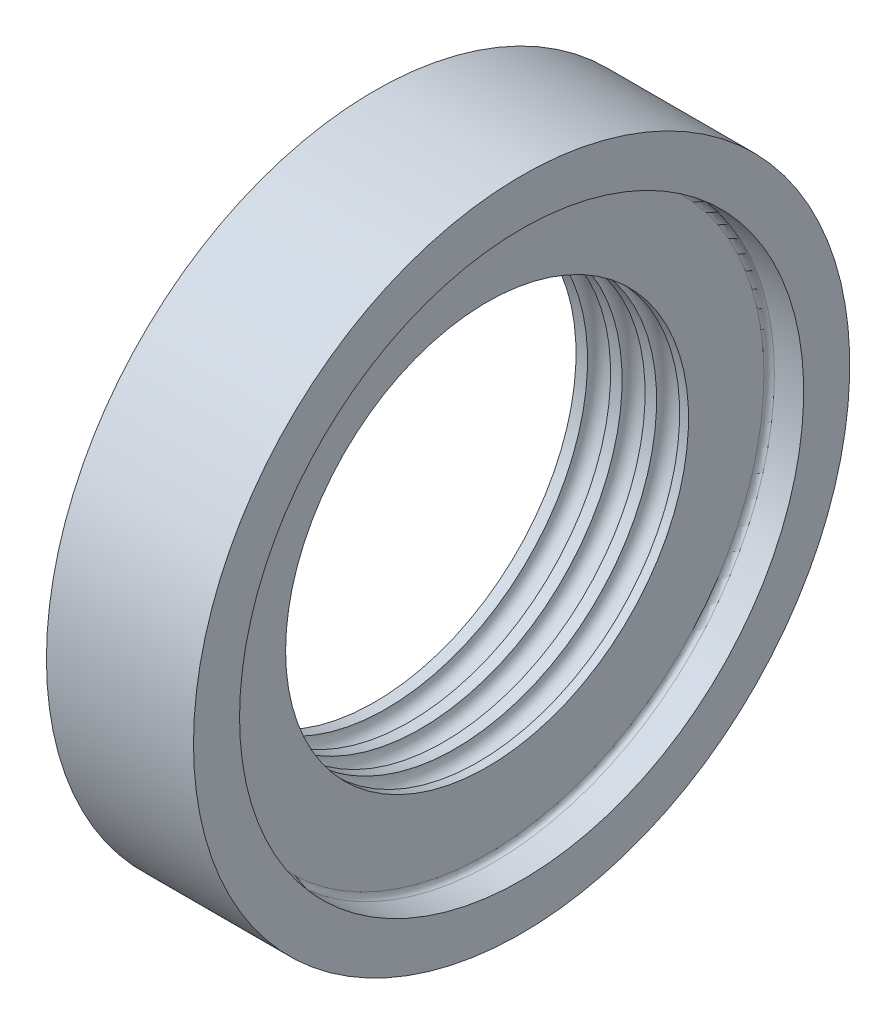
ISO-10303-21;
HEADER;
FILE_DESCRIPTION(('STEP AP214'),'2;1');
FILE_NAME('part.step','',(''),(''),'','','');
FILE_SCHEMA(('AUTOMOTIVE_DESIGN { 1 0 10303 214 1 1 1 1 }'));
ENDSEC;
DATA;
#1=APPLICATION_CONTEXT('core data for automotive mechanical design processes');
#2=APPLICATION_PROTOCOL_DEFINITION('international standard','automotive_design',2000,#1);
#3=PRODUCT_CONTEXT('',#1,'mechanical');
#4=PRODUCT('Part','Part','',(#3));
#5=PRODUCT_RELATED_PRODUCT_CATEGORY('part','',(#4));
#6=PRODUCT_DEFINITION_FORMATION('','',#4);
#7=PRODUCT_DEFINITION_CONTEXT('part definition',#1,'design');
#8=PRODUCT_DEFINITION('design','',#6,#7);
#9=PRODUCT_DEFINITION_SHAPE('','',#8);
#10=(LENGTH_UNIT() NAMED_UNIT(*) SI_UNIT(.MILLI.,.METRE.));
#11=(NAMED_UNIT(*) PLANE_ANGLE_UNIT() SI_UNIT($,.RADIAN.));
#12=(NAMED_UNIT(*) SI_UNIT($,.STERADIAN.) SOLID_ANGLE_UNIT());
#13=UNCERTAINTY_MEASURE_WITH_UNIT(LENGTH_MEASURE(1.E-05),#10,'distance_accuracy_value','');
#14=(GEOMETRIC_REPRESENTATION_CONTEXT(3) GLOBAL_UNCERTAINTY_ASSIGNED_CONTEXT((#13)) GLOBAL_UNIT_ASSIGNED_CONTEXT((#10,
#11,#12)) REPRESENTATION_CONTEXT('',''));
#15=CARTESIAN_POINT('',(0.,0.,0.));
#16=DIRECTION('',(0.,0.,1.));
#17=DIRECTION('',(1.,0.,0.));
#18=AXIS2_PLACEMENT_3D('',#15,#16,#17);
#19=CARTESIAN_POINT('',(8.8,0.,31.35));
#20=DIRECTION('',(-1.,0.,0.));
#21=DIRECTION('',(0.,0.,1.));
#22=AXIS2_PLACEMENT_3D('',#19,#20,#21);
#23=PLANE('',#22);
#24=CARTESIAN_POINT('',(8.8,0.,-25.3));
#25=DIRECTION('',(-1.,0.,0.));
#26=DIRECTION('',(0.,0.,1.));
#27=AXIS2_PLACEMENT_3D('',#24,#25,#26);
#28=CIRCLE('',#27,1.64999999999999);
#29=CARTESIAN_POINT('',(8.8,0.,-23.65));
#30=VERTEX_POINT('',#29);
#31=EDGE_CURVE('E61',#30,#30,#28,.T.);
#32=ORIENTED_EDGE('',*,*,#31,.F.);
#33=EDGE_LOOP('',(#32));
#34=FACE_BOUND('',#33,.T.);
#35=CARTESIAN_POINT('',(8.8,0.,25.3));
#36=DIRECTION('',(-1.,0.,0.));
#37=DIRECTION('',(0.,0.,1.));
#38=AXIS2_PLACEMENT_3D('',#35,#36,#37);
#39=CIRCLE('',#38,1.64999999999999);
#40=CARTESIAN_POINT('',(8.8,0.,26.95));
#41=VERTEX_POINT('',#40);
#42=EDGE_CURVE('E60',#41,#41,#39,.T.);
#43=ORIENTED_EDGE('',*,*,#42,.F.);
#44=EDGE_LOOP('',(#43));
#45=FACE_BOUND('',#44,.T.);
#46=CARTESIAN_POINT('',(8.8,0.,0.));
#47=DIRECTION('',(-1.,0.,0.));
#48=DIRECTION('',(0.,0.,1.));
#49=AXIS2_PLACEMENT_3D('',#46,#47,#48);
#50=CIRCLE('',#49,31.35);
#51=CARTESIAN_POINT('',(8.8,0.,31.35));
#52=VERTEX_POINT('',#51);
#53=EDGE_CURVE('E71',#52,#52,#50,.T.);
#54=ORIENTED_EDGE('',*,*,#53,.T.);
#55=EDGE_LOOP('',(#54));
#56=FACE_BOUND('',#55,.T.);
#57=CARTESIAN_POINT('',(8.8,0.,0.));
#58=DIRECTION('',(-1.,0.,0.));
#59=DIRECTION('',(0.,0.,1.));
#60=AXIS2_PLACEMENT_3D('',#57,#58,#59);
#61=CIRCLE('',#60,19.25);
#62=CARTESIAN_POINT('',(8.8,0.,19.25));
#63=VERTEX_POINT('',#62);
#64=EDGE_CURVE('E101',#63,#63,#61,.T.);
#65=ORIENTED_EDGE('',*,*,#64,.F.);
#66=EDGE_LOOP('',(#65));
#67=FACE_BOUND('',#66,.T.);
#68=ADVANCED_FACE('F36',(#34,#45,#56,#67),#23,.T.);
#69=CARTESIAN_POINT('',(4.10140217499936,0.,0.));
#70=DIRECTION('',(-1.,0.,0.));
#71=DIRECTION('',(0.,0.,1.));
#72=AXIS2_PLACEMENT_3D('',#69,#70,#71);
#73=CYLINDRICAL_SURFACE('',#72,19.25);
#74=ORIENTED_EDGE('',*,*,#64,.T.);
#75=EDGE_LOOP('',(#74));
#76=FACE_BOUND('',#75,.T.);
#77=CARTESIAN_POINT('',(9.9,0.,0.));
#78=DIRECTION('',(-1.,0.,0.));
#79=DIRECTION('',(0.,0.,1.));
#80=AXIS2_PLACEMENT_3D('',#77,#78,#79);
#81=CIRCLE('',#80,19.25);
#82=CARTESIAN_POINT('',(9.9,0.,19.25));
#83=VERTEX_POINT('',#82);
#84=EDGE_CURVE('E98',#83,#83,#81,.T.);
#85=ORIENTED_EDGE('',*,*,#84,.F.);
#86=EDGE_LOOP('',(#85));
#87=FACE_BOUND('',#86,.T.);
#88=ADVANCED_FACE('F117',(#76,#87),#73,.F.);
#89=CARTESIAN_POINT('',(11.,0.,0.));
#90=DIRECTION('',(-1.,0.,0.));
#91=DIRECTION('',(0.,0.,1.));
#92=AXIS2_PLACEMENT_3D('',#89,#90,#91);
#93=TOROIDAL_SURFACE('',#92,19.25,1.1);
#94=ORIENTED_EDGE('',*,*,#84,.T.);
#95=EDGE_LOOP('',(#94));
#96=FACE_BOUND('',#95,.T.);
#97=CARTESIAN_POINT('',(12.1,0.,0.));
#98=DIRECTION('',(-1.,0.,0.));
#99=DIRECTION('',(0.,0.,1.));
#100=AXIS2_PLACEMENT_3D('',#97,#98,#99);
#101=CIRCLE('',#100,19.25);
#102=CARTESIAN_POINT('',(12.1,0.,19.25));
#103=VERTEX_POINT('',#102);
#104=EDGE_CURVE('E95',#103,#103,#101,.T.);
#105=ORIENTED_EDGE('',*,*,#104,.F.);
#106=EDGE_LOOP('',(#105));
#107=FACE_BOUND('',#106,.T.);
#108=ADVANCED_FACE('F122',(#96,#107),#93,.F.);
#109=CARTESIAN_POINT('',(4.10140217499936,0.,0.));
#110=DIRECTION('',(-1.,0.,0.));
#111=DIRECTION('',(0.,0.,1.));
#112=AXIS2_PLACEMENT_3D('',#109,#110,#111);
#113=CYLINDRICAL_SURFACE('',#112,19.25);
#114=ORIENTED_EDGE('',*,*,#104,.T.);
#115=EDGE_LOOP('',(#114));
#116=FACE_BOUND('',#115,.T.);
#117=CARTESIAN_POINT('',(13.2,0.,0.));
#118=DIRECTION('',(-1.,0.,0.));
#119=DIRECTION('',(0.,0.,1.));
#120=AXIS2_PLACEMENT_3D('',#117,#118,#119);
#121=CIRCLE('',#120,19.25);
#122=CARTESIAN_POINT('',(13.2,0.,19.25));
#123=VERTEX_POINT('',#122);
#124=EDGE_CURVE('E92',#123,#123,#121,.T.);
#125=ORIENTED_EDGE('',*,*,#124,.F.);
#126=EDGE_LOOP('',(#125));
#127=FACE_BOUND('',#126,.T.);
#128=ADVANCED_FACE('F130',(#116,#127),#113,.F.);
#129=CARTESIAN_POINT('',(14.3,0.,0.));
#130=DIRECTION('',(-1.,0.,0.));
#131=DIRECTION('',(0.,0.,1.));
#132=AXIS2_PLACEMENT_3D('',#129,#130,#131);
#133=TOROIDAL_SURFACE('',#132,19.25,1.1);
#134=ORIENTED_EDGE('',*,*,#124,.T.);
#135=EDGE_LOOP('',(#134));
#136=FACE_BOUND('',#135,.T.);
#137=CARTESIAN_POINT('',(15.4,0.,0.));
#138=DIRECTION('',(-1.,0.,0.));
#139=DIRECTION('',(0.,0.,1.));
#140=AXIS2_PLACEMENT_3D('',#137,#138,#139);
#141=CIRCLE('',#140,19.25);
#142=CARTESIAN_POINT('',(15.4,0.,19.25));
#143=VERTEX_POINT('',#142);
#144=EDGE_CURVE('E89',#143,#143,#141,.T.);
#145=ORIENTED_EDGE('',*,*,#144,.F.);
#146=EDGE_LOOP('',(#145));
#147=FACE_BOUND('',#146,.T.);
#148=ADVANCED_FACE('F134',(#136,#147),#133,.F.);
#149=CARTESIAN_POINT('',(4.10140217499936,0.,0.));
#150=DIRECTION('',(-1.,0.,0.));
#151=DIRECTION('',(0.,0.,1.));
#152=AXIS2_PLACEMENT_3D('',#149,#150,#151);
#153=CYLINDRICAL_SURFACE('',#152,19.25);
#154=ORIENTED_EDGE('',*,*,#144,.T.);
#155=EDGE_LOOP('',(#154));
#156=FACE_BOUND('',#155,.T.);
#157=CARTESIAN_POINT('',(16.5,0.,0.));
#158=DIRECTION('',(-1.,0.,0.));
#159=DIRECTION('',(0.,0.,1.));
#160=AXIS2_PLACEMENT_3D('',#157,#158,#159);
#161=CIRCLE('',#160,19.25);
#162=CARTESIAN_POINT('',(16.5,0.,19.25));
#163=VERTEX_POINT('',#162);
#164=EDGE_CURVE('E86',#163,#163,#161,.T.);
#165=ORIENTED_EDGE('',*,*,#164,.F.);
#166=EDGE_LOOP('',(#165));
#167=FACE_BOUND('',#166,.T.);
#168=ADVANCED_FACE('F138',(#156,#167),#153,.F.);
#169=CARTESIAN_POINT('',(17.6,0.,0.));
#170=DIRECTION('',(-1.,0.,0.));
#171=DIRECTION('',(0.,0.,1.));
#172=AXIS2_PLACEMENT_3D('',#169,#170,#171);
#173=TOROIDAL_SURFACE('',#172,19.25,1.1);
#174=ORIENTED_EDGE('',*,*,#164,.T.);
#175=EDGE_LOOP('',(#174));
#176=FACE_BOUND('',#175,.T.);
#177=CARTESIAN_POINT('',(18.7,0.,0.));
#178=DIRECTION('',(-1.,0.,0.));
#179=DIRECTION('',(0.,0.,1.));
#180=AXIS2_PLACEMENT_3D('',#177,#178,#179);
#181=CIRCLE('',#180,19.25);
#182=CARTESIAN_POINT('',(18.7,0.,19.25));
#183=VERTEX_POINT('',#182);
#184=EDGE_CURVE('E83',#183,#183,#181,.T.);
#185=ORIENTED_EDGE('',*,*,#184,.F.);
#186=EDGE_LOOP('',(#185));
#187=FACE_BOUND('',#186,.T.);
#188=ADVANCED_FACE('F142',(#176,#187),#173,.F.);
#189=CARTESIAN_POINT('',(4.10140217499936,0.,0.));
#190=DIRECTION('',(-1.,0.,0.));
#191=DIRECTION('',(0.,0.,1.));
#192=AXIS2_PLACEMENT_3D('',#189,#190,#191);
#193=CYLINDRICAL_SURFACE('',#192,19.25);
#194=ORIENTED_EDGE('',*,*,#184,.T.);
#195=EDGE_LOOP('',(#194));
#196=FACE_BOUND('',#195,.T.);
#197=CARTESIAN_POINT('',(19.55,0.,0.));
#198=DIRECTION('',(-1.,0.,0.));
#199=DIRECTION('',(0.,0.,1.));
#200=AXIS2_PLACEMENT_3D('',#197,#198,#199);
#201=CIRCLE('',#200,19.25);
#202=CARTESIAN_POINT('',(19.55,0.,19.25));
#203=VERTEX_POINT('',#202);
#204=EDGE_CURVE('E80',#203,#203,#201,.T.);
#205=ORIENTED_EDGE('',*,*,#204,.F.);
#206=EDGE_LOOP('',(#205));
#207=FACE_BOUND('',#206,.T.);
#208=ADVANCED_FACE('F146',(#196,#207),#193,.F.);
#209=CARTESIAN_POINT('',(19.55,0.,19.25));
#210=DIRECTION('',(1.,0.,0.));
#211=DIRECTION('',(0.,0.,-1.));
#212=AXIS2_PLACEMENT_3D('',#209,#210,#211);
#213=PLANE('',#212);
#214=CARTESIAN_POINT('',(19.55,0.,0.));
#215=DIRECTION('',(1.,0.,0.));
#216=DIRECTION('',(0.,0.,-1.));
#217=AXIS2_PLACEMENT_3D('',#214,#215,#216);
#218=CIRCLE('',#217,26.45);
#219=CARTESIAN_POINT('',(19.55,0.,-26.45));
#220=VERTEX_POINT('',#219);
#221=EDGE_CURVE('E11',#220,#220,#218,.T.);
#222=ORIENTED_EDGE('',*,*,#221,.T.);
#223=EDGE_LOOP('',(#222));
#224=FACE_BOUND('',#223,.T.);
#225=ORIENTED_EDGE('',*,*,#204,.T.);
#226=EDGE_LOOP('',(#225));
#227=FACE_BOUND('',#226,.T.);
#228=ADVANCED_FACE('F150',(#224,#227),#213,.T.);
#229=CARTESIAN_POINT('',(4.10140217499936,0.,0.));
#230=DIRECTION('',(-1.,0.,0.));
#231=DIRECTION('',(0.,0.,1.));
#232=AXIS2_PLACEMENT_3D('',#229,#230,#231);
#233=CYLINDRICAL_SURFACE('',#232,26.95);
#234=CARTESIAN_POINT('',(20.05,0.,0.));
#235=DIRECTION('',(1.,0.,0.));
#236=DIRECTION('',(0.,0.,-1.));
#237=AXIS2_PLACEMENT_3D('',#234,#235,#236);
#238=CIRCLE('',#237,26.95);
#239=CARTESIAN_POINT('',(20.05,0.,-26.95));
#240=VERTEX_POINT('',#239);
#241=EDGE_CURVE('E44',#240,#240,#238,.F.);
#242=ORIENTED_EDGE('',*,*,#241,.T.);
#243=EDGE_LOOP('',(#242));
#244=FACE_BOUND('',#243,.T.);
#245=CARTESIAN_POINT('',(22.85,0.,0.));
#246=DIRECTION('',(-1.,0.,0.));
#247=DIRECTION('',(0.,0.,1.));
#248=AXIS2_PLACEMENT_3D('',#245,#246,#247);
#249=CIRCLE('',#248,26.95);
#250=CARTESIAN_POINT('',(22.85,0.,26.95));
#251=VERTEX_POINT('',#250);
#252=EDGE_CURVE('E77',#251,#251,#249,.T.);
#253=ORIENTED_EDGE('',*,*,#252,.F.);
#254=EDGE_LOOP('',(#253));
#255=FACE_BOUND('',#254,.T.);
#256=ADVANCED_FACE('F106',(#244,#255),#233,.F.);
#257=CARTESIAN_POINT('',(22.85,0.,26.95));
#258=DIRECTION('',(1.,0.,0.));
#259=DIRECTION('',(0.,0.,-1.));
#260=AXIS2_PLACEMENT_3D('',#257,#258,#259);
#261=PLANE('',#260);
#262=ORIENTED_EDGE('',*,*,#252,.T.);
#263=EDGE_LOOP('',(#262));
#264=FACE_BOUND('',#263,.T.);
#265=CARTESIAN_POINT('',(22.85,0.,0.));
#266=DIRECTION('',(-1.,0.,0.));
#267=DIRECTION('',(0.,0.,1.));
#268=AXIS2_PLACEMENT_3D('',#265,#266,#267);
#269=CIRCLE('',#268,31.35);
#270=CARTESIAN_POINT('',(22.85,0.,31.35));
#271=VERTEX_POINT('',#270);
#272=EDGE_CURVE('E74',#271,#271,#269,.T.);
#273=ORIENTED_EDGE('',*,*,#272,.F.);
#274=EDGE_LOOP('',(#273));
#275=FACE_BOUND('',#274,.T.);
#276=ADVANCED_FACE('F157',(#264,#275),#261,.T.);
#277=CARTESIAN_POINT('',(4.10140217499936,0.,0.));
#278=DIRECTION('',(-1.,0.,0.));
#279=DIRECTION('',(0.,0.,1.));
#280=AXIS2_PLACEMENT_3D('',#277,#278,#279);
#281=CYLINDRICAL_SURFACE('',#280,31.35);
#282=ORIENTED_EDGE('',*,*,#272,.T.);
#283=EDGE_LOOP('',(#282));
#284=FACE_BOUND('',#283,.T.);
#285=ORIENTED_EDGE('',*,*,#53,.F.);
#286=EDGE_LOOP('',(#285));
#287=FACE_BOUND('',#286,.T.);
#288=ADVANCED_FACE('F160',(#284,#287),#281,.T.);
#289=CARTESIAN_POINT('',(13.75,0.,25.3));
#290=DIRECTION('',(-1.,0.,0.));
#291=DIRECTION('',(0.,0.,1.));
#292=AXIS2_PLACEMENT_3D('',#289,#290,#291);
#293=CONICAL_SURFACE('',#292,1.64999999999999,0.986111027376791);
#294=CARTESIAN_POINT('',(14.8421111759729,0.,25.3));
#295=VERTEX_POINT('',#294);
#296=VERTEX_LOOP('',#295);
#297=FACE_BOUND('',#296,.T.);
#298=CARTESIAN_POINT('',(13.75,0.,25.3));
#299=DIRECTION('',(-1.,0.,0.));
#300=DIRECTION('',(0.,0.,1.));
#301=AXIS2_PLACEMENT_3D('',#298,#299,#300);
#302=CIRCLE('',#301,1.64999999999999);
#303=CARTESIAN_POINT('',(13.75,0.,26.95));
#304=VERTEX_POINT('',#303);
#305=EDGE_CURVE('E64',#304,#304,#302,.T.);
#306=ORIENTED_EDGE('',*,*,#305,.T.);
#307=EDGE_LOOP('',(#306));
#308=FACE_BOUND('',#307,.T.);
#309=ADVANCED_FACE('F164',(#297,#308),#293,.F.);
#310=CARTESIAN_POINT('',(8.8,0.,25.3));
#311=DIRECTION('',(-1.,0.,0.));
#312=DIRECTION('',(0.,0.,1.));
#313=AXIS2_PLACEMENT_3D('',#310,#311,#312);
#314=CYLINDRICAL_SURFACE('',#313,1.64999999999999);
#315=ORIENTED_EDGE('',*,*,#305,.F.);
#316=EDGE_LOOP('',(#315));
#317=FACE_BOUND('',#316,.T.);
#318=ORIENTED_EDGE('',*,*,#42,.T.);
#319=EDGE_LOOP('',(#318));
#320=FACE_BOUND('',#319,.T.);
#321=ADVANCED_FACE('F54',(#317,#320),#314,.F.);
#322=CARTESIAN_POINT('',(13.75,0.,-25.3));
#323=DIRECTION('',(-1.,0.,0.));
#324=DIRECTION('',(0.,0.,1.));
#325=AXIS2_PLACEMENT_3D('',#322,#323,#324);
#326=CONICAL_SURFACE('',#325,1.64999999999999,0.986111027376791);
#327=CARTESIAN_POINT('',(14.8421111759729,0.,-25.3));
#328=VERTEX_POINT('',#327);
#329=VERTEX_LOOP('',#328);
#330=FACE_BOUND('',#329,.T.);
#331=CARTESIAN_POINT('',(13.75,0.,-25.3));
#332=DIRECTION('',(-1.,0.,0.));
#333=DIRECTION('',(0.,0.,1.));
#334=AXIS2_PLACEMENT_3D('',#331,#332,#333);
#335=CIRCLE('',#334,1.64999999999999);
#336=CARTESIAN_POINT('',(13.75,0.,-23.65));
#337=VERTEX_POINT('',#336);
#338=EDGE_CURVE('E58',#337,#337,#335,.T.);
#339=ORIENTED_EDGE('',*,*,#338,.T.);
#340=EDGE_LOOP('',(#339));
#341=FACE_BOUND('',#340,.T.);
#342=ADVANCED_FACE('F50',(#330,#341),#326,.F.);
#343=CARTESIAN_POINT('',(8.8,0.,-25.3));
#344=DIRECTION('',(-1.,0.,0.));
#345=DIRECTION('',(0.,0.,1.));
#346=AXIS2_PLACEMENT_3D('',#343,#344,#345);
#347=CYLINDRICAL_SURFACE('',#346,1.64999999999999);
#348=ORIENTED_EDGE('',*,*,#338,.F.);
#349=EDGE_LOOP('',(#348));
#350=FACE_BOUND('',#349,.T.);
#351=ORIENTED_EDGE('',*,*,#31,.T.);
#352=EDGE_LOOP('',(#351));
#353=FACE_BOUND('',#352,.T.);
#354=ADVANCED_FACE('F53',(#350,#353),#347,.F.);
#355=CARTESIAN_POINT('',(20.05,0.,0.));
#356=DIRECTION('',(1.,0.,0.));
#357=DIRECTION('',(0.,0.,-1.));
#358=AXIS2_PLACEMENT_3D('',#355,#356,#357);
#359=TOROIDAL_SURFACE('',#358,26.45,0.5);
#360=ORIENTED_EDGE('',*,*,#221,.F.);
#361=EDGE_LOOP('',(#360));
#362=FACE_BOUND('',#361,.T.);
#363=ORIENTED_EDGE('',*,*,#241,.F.);
#364=EDGE_LOOP('',(#363));
#365=FACE_BOUND('',#364,.T.);
#366=ADVANCED_FACE('F38',(#362,#365),#359,.F.);
#367=CLOSED_SHELL('',(#68,#88,#108,#128,#148,#168,#188,#208,#228,#256,#276,#288,#309,#321,#342,
#354,#366));
#368=MANIFOLD_SOLID_BREP('B2',#367);
#369=ADVANCED_BREP_SHAPE_REPRESENTATION('',(#18,#368),#14);
#370=SHAPE_DEFINITION_REPRESENTATION(#9,#369);
ENDSEC;
END-ISO-10303-21;
